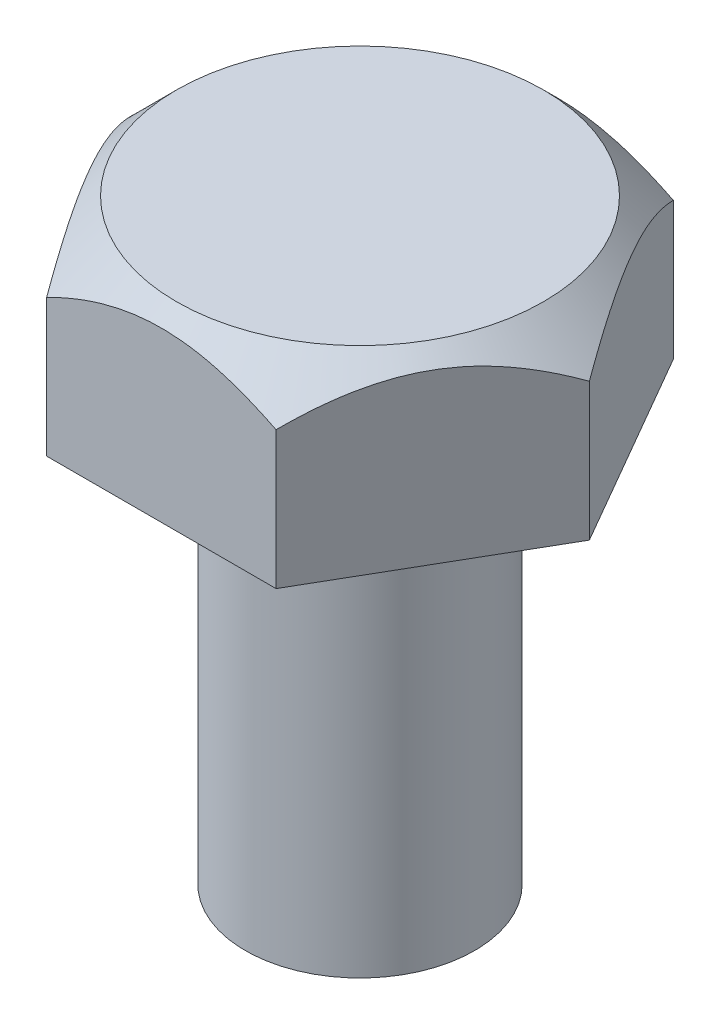
ISO-10303-21;
HEADER;
FILE_DESCRIPTION(('STEP AP214'),'2;1');
FILE_NAME('part.step','',(''),(''),'','','');
FILE_SCHEMA(('AUTOMOTIVE_DESIGN { 1 0 10303 214 1 1 1 1 }'));
ENDSEC;
DATA;
#1=APPLICATION_CONTEXT('core data for automotive mechanical design processes');
#2=APPLICATION_PROTOCOL_DEFINITION('international standard','automotive_design',2000,#1);
#3=PRODUCT_CONTEXT('',#1,'mechanical');
#4=PRODUCT('Part','Part','',(#3));
#5=PRODUCT_RELATED_PRODUCT_CATEGORY('part','',(#4));
#6=PRODUCT_DEFINITION_FORMATION('','',#4);
#7=PRODUCT_DEFINITION_CONTEXT('part definition',#1,'design');
#8=PRODUCT_DEFINITION('design','',#6,#7);
#9=PRODUCT_DEFINITION_SHAPE('','',#8);
#10=(LENGTH_UNIT() NAMED_UNIT(*) SI_UNIT(.MILLI.,.METRE.));
#11=(NAMED_UNIT(*) PLANE_ANGLE_UNIT() SI_UNIT($,.RADIAN.));
#12=(NAMED_UNIT(*) SI_UNIT($,.STERADIAN.) SOLID_ANGLE_UNIT());
#13=UNCERTAINTY_MEASURE_WITH_UNIT(LENGTH_MEASURE(1.E-05),#10,'distance_accuracy_value','');
#14=(GEOMETRIC_REPRESENTATION_CONTEXT(3) GLOBAL_UNCERTAINTY_ASSIGNED_CONTEXT((#13)) GLOBAL_UNIT_ASSIGNED_CONTEXT((#10,
#11,#12)) REPRESENTATION_CONTEXT('',''));
#15=CARTESIAN_POINT('',(0.,0.,0.));
#16=DIRECTION('',(0.,0.,1.));
#17=DIRECTION('',(1.,0.,0.));
#18=AXIS2_PLACEMENT_3D('',#15,#16,#17);
#19=CARTESIAN_POINT('',(0.,13.,0.));
#20=DIRECTION('',(0.,-1.,0.));
#21=DIRECTION('',(0.,0.,-1.));
#22=AXIS2_PLACEMENT_3D('',#19,#20,#21);
#23=CYLINDRICAL_SURFACE('',#22,2.5);
#24=CARTESIAN_POINT('',(0.,0.,0.));
#25=DIRECTION('',(0.,1.,0.));
#26=DIRECTION('',(0.,0.,1.));
#27=AXIS2_PLACEMENT_3D('',#24,#25,#26);
#28=CIRCLE('',#27,2.5);
#29=CARTESIAN_POINT('',(0.,0.,-2.5));
#30=VERTEX_POINT('',#29);
#31=EDGE_CURVE('E54',#30,#30,#28,.T.);
#32=CARTESIAN_POINT('',(0.,9.,0.));
#33=DIRECTION('',(0.,1.,0.));
#34=DIRECTION('',(0.,0.,1.));
#35=AXIS2_PLACEMENT_3D('',#32,#33,#34);
#36=CIRCLE('',#35,2.5);
#37=CARTESIAN_POINT('',(0.,9.,-2.5));
#38=VERTEX_POINT('',#37);
#39=EDGE_CURVE('E12',#38,#38,#36,.T.);
#40=CARTESIAN_POINT('',(0.,0.,-2.5));
#41=CARTESIAN_POINT('',(0.,0.0937500000000001,-2.5));
#42=CARTESIAN_POINT('',(0.,0.1875,-2.5));
#43=CARTESIAN_POINT('',(0.,0.375,-2.5));
#44=CARTESIAN_POINT('',(0.,0.46875,-2.5));
#45=CARTESIAN_POINT('',(0.,0.656250000000001,-2.5));
#46=CARTESIAN_POINT('',(0.,0.750000000000001,-2.5));
#47=CARTESIAN_POINT('',(0.,0.9375,-2.5));
#48=CARTESIAN_POINT('',(0.,1.03125,-2.5));
#49=CARTESIAN_POINT('',(0.,1.21875,-2.5));
#50=CARTESIAN_POINT('',(0.,1.3125,-2.5));
#51=CARTESIAN_POINT('',(0.,1.5,-2.5));
#52=CARTESIAN_POINT('',(0.,1.59375,-2.5));
#53=CARTESIAN_POINT('',(0.,1.78125,-2.5));
#54=CARTESIAN_POINT('',(0.,1.875,-2.5));
#55=CARTESIAN_POINT('',(0.,2.0625,-2.5));
#56=CARTESIAN_POINT('',(0.,2.15625,-2.5));
#57=CARTESIAN_POINT('',(0.,2.34375,-2.5));
#58=CARTESIAN_POINT('',(0.,2.4375,-2.5));
#59=CARTESIAN_POINT('',(0.,2.625,-2.5));
#60=CARTESIAN_POINT('',(0.,2.71875,-2.5));
#61=CARTESIAN_POINT('',(0.,2.90625,-2.5));
#62=CARTESIAN_POINT('',(0.,3.,-2.5));
#63=CARTESIAN_POINT('',(0.,3.1875,-2.5));
#64=CARTESIAN_POINT('',(0.,3.28125,-2.5));
#65=CARTESIAN_POINT('',(0.,3.46875,-2.5));
#66=CARTESIAN_POINT('',(0.,3.5625,-2.5));
#67=CARTESIAN_POINT('',(0.,3.75,-2.5));
#68=CARTESIAN_POINT('',(0.,3.84375,-2.5));
#69=CARTESIAN_POINT('',(0.,4.03125,-2.5));
#70=CARTESIAN_POINT('',(0.,4.125,-2.5));
#71=CARTESIAN_POINT('',(0.,4.3125,-2.5));
#72=CARTESIAN_POINT('',(0.,4.40625,-2.5));
#73=CARTESIAN_POINT('',(0.,4.59375,-2.5));
#74=CARTESIAN_POINT('',(0.,4.6875,-2.5));
#75=CARTESIAN_POINT('',(0.,4.875,-2.5));
#76=CARTESIAN_POINT('',(0.,4.96875,-2.5));
#77=CARTESIAN_POINT('',(0.,5.15625,-2.5));
#78=CARTESIAN_POINT('',(0.,5.25,-2.5));
#79=CARTESIAN_POINT('',(0.,5.4375,-2.5));
#80=CARTESIAN_POINT('',(0.,5.53125,-2.5));
#81=CARTESIAN_POINT('',(0.,5.71875,-2.5));
#82=CARTESIAN_POINT('',(0.,5.8125,-2.5));
#83=CARTESIAN_POINT('',(0.,6.,-2.5));
#84=CARTESIAN_POINT('',(0.,6.09375,-2.5));
#85=CARTESIAN_POINT('',(0.,6.28125,-2.5));
#86=CARTESIAN_POINT('',(0.,6.375,-2.5));
#87=CARTESIAN_POINT('',(0.,6.5625,-2.5));
#88=CARTESIAN_POINT('',(0.,6.65625,-2.5));
#89=CARTESIAN_POINT('',(0.,6.84375,-2.5));
#90=CARTESIAN_POINT('',(0.,6.9375,-2.5));
#91=CARTESIAN_POINT('',(0.,7.125,-2.5));
#92=CARTESIAN_POINT('',(0.,7.21875,-2.5));
#93=CARTESIAN_POINT('',(0.,7.40625,-2.5));
#94=CARTESIAN_POINT('',(0.,7.5,-2.5));
#95=CARTESIAN_POINT('',(0.,7.6875,-2.5));
#96=CARTESIAN_POINT('',(0.,7.78125,-2.5));
#97=CARTESIAN_POINT('',(0.,7.96875,-2.5));
#98=CARTESIAN_POINT('',(0.,8.0625,-2.5));
#99=CARTESIAN_POINT('',(0.,8.25,-2.5));
#100=CARTESIAN_POINT('',(0.,8.34375,-2.5));
#101=CARTESIAN_POINT('',(0.,8.53125,-2.5));
#102=CARTESIAN_POINT('',(0.,8.625,-2.5));
#103=CARTESIAN_POINT('',(0.,8.8125,-2.5));
#104=CARTESIAN_POINT('',(0.,8.90625,-2.5));
#105=CARTESIAN_POINT('',(0.,9.,-2.5));
#106=B_SPLINE_CURVE_WITH_KNOTS('',3,(#40,#41,#42,#43,#44,#45,#46,#47,#48,#49,#50,#51,#52,#53,
#54,#55,#56,#57,#58,#59,#60,#61,#62,#63,#64,#65,#66,#67,#68,#69,#70,#71,#72,#73,#74,#75,#76,#77,
#78,#79,#80,#81,#82,#83,#84,#85,#86,#87,#88,#89,#90,#91,#92,#93,#94,#95,#96,#97,#98,#99,#100,
#101,#102,#103,#104,#105),.UNSPECIFIED.,.F.,.F.,(4,2,2,2,2,2,2,2,2,2,2,2,2,2,2,2,2,2,2,2,2,2,2,
2,2,2,2,2,2,2,2,2,4),(0.,0.28125,0.5625,0.843750000000001,1.125,1.40625,1.6875,1.96875,2.25,
2.53125,2.8125,3.09375,3.375,3.65625,3.9375,4.21875,4.5,4.78125,5.0625,5.34375,5.625,5.90625,
6.1875,6.46875,6.75,7.03125,7.3125,7.59375,7.875,8.15625,8.4375,8.71875,9.),.UNSPECIFIED.);
#107=EDGE_CURVE('BSEAM46',#30,#38,#106,.T.);
#108=ORIENTED_EDGE('',*,*,#31,.T.);
#109=ORIENTED_EDGE('',*,*,#39,.F.);
#110=ORIENTED_EDGE('',*,*,#107,.T.);
#111=ORIENTED_EDGE('',*,*,#107,.F.);
#112=EDGE_LOOP('',(#108,#110,#109,#111));
#113=FACE_BOUND('',#112,.T.);
#114=ADVANCED_FACE('F46',(#113),#23,.T.);
#115=CARTESIAN_POINT('',(0.,0.,0.));
#116=DIRECTION('',(0.,1.,0.));
#117=DIRECTION('',(0.,0.,1.));
#118=AXIS2_PLACEMENT_3D('',#115,#116,#117);
#119=PLANE('',#118);
#120=ORIENTED_EDGE('',*,*,#31,.F.);
#121=EDGE_LOOP('',(#120));
#122=FACE_BOUND('',#121,.T.);
#123=ADVANCED_FACE('F243',(#122),#119,.F.);
#124=CARTESIAN_POINT('',(2.5,9.,4.3301270189222));
#125=DIRECTION('',(0.866025403784439,0.,0.5));
#126=DIRECTION('',(0.5,0.,-0.866025403784439));
#127=AXIS2_PLACEMENT_3D('',#124,#125,#126);
#128=PLANE('',#127);
#129=CARTESIAN_POINT('',(2.49988452994616,11.9998845259463,4.3303270189222));
#130=CARTESIAN_POINT('',(2.54287138041576,12.0428679014172,4.25587160985149));
#131=CARTESIAN_POINT('',(2.58618865330985,12.0845322160249,4.18084389235359));
#132=CARTESIAN_POINT('',(2.67354887274435,12.1648214570814,4.02953155373268));
#133=CARTESIAN_POINT('',(2.71759219997896,12.2034447234691,3.95324627322796));
#134=CARTESIAN_POINT('',(2.85131771209198,12.3144804420678,3.72162689198003));
#135=CARTESIAN_POINT('',(2.94213197757914,12.3815850955109,3.56433197010422));
#136=CARTESIAN_POINT('',(3.12526622915858,12.4964973477853,3.24713414176253));
#137=CARTESIAN_POINT('',(3.21753940303059,12.5445944631137,3.08731231644056));
#138=CARTESIAN_POINT('',(3.35746623690526,12.6002311247179,2.8449519308274));
#139=CARTESIAN_POINT('',(3.40431453249364,12.616017735568,2.76380830262032));
#140=CARTESIAN_POINT('',(3.4984078137364,12.6417307019677,2.60083395885699));
#141=CARTESIAN_POINT('',(3.54565273902893,12.6516579334098,2.51900334785054));
#142=CARTESIAN_POINT('',(3.66078037944806,12.6683021731439,2.31959642528907));
#143=CARTESIAN_POINT('',(3.72878713668329,12.6717946588034,2.20180526649965));
#144=CARTESIAN_POINT('',(3.86467809794897,12.6659341038672,1.96643521729812));
#145=CARTESIAN_POINT('',(3.93256225066695,12.6565765602643,1.84885641576182));
#146=CARTESIAN_POINT('',(4.06769057590285,12.6255675384182,1.61480729091154));
#147=CARTESIAN_POINT('',(4.13493394699394,12.6039023105296,1.49833835570957));
#148=CARTESIAN_POINT('',(4.26826494691756,12.5494557859257,1.26740228961789));
#149=CARTESIAN_POINT('',(4.33435266395686,12.516675341522,1.1529350059496));
#150=CARTESIAN_POINT('',(4.45167355371377,12.4492338613143,0.949729264101435));
#151=CARTESIAN_POINT('',(4.5031664451357,12.4163460937711,0.860540959930032));
#152=CARTESIAN_POINT('',(4.60522781060438,12.3452704801556,0.683765489448425));
#153=CARTESIAN_POINT('',(4.65579625649568,12.3070824729595,0.596178371904879));
#154=CARTESIAN_POINT('',(4.75584946376349,12.226262498628,0.422881133456824));
#155=CARTESIAN_POINT('',(4.80533707077893,12.1836445061233,0.337166083761072));
#156=CARTESIAN_POINT('',(4.90339584958638,12.0945241637333,0.167323296738408));
#157=CARTESIAN_POINT('',(4.95196756146993,12.048024196775,0.083194623945508));
#158=CARTESIAN_POINT('',(5.00011547005384,11.9998845259463,-0.000200000000000584));
#159=B_SPLINE_CURVE_WITH_KNOTS('',3,(#129,#130,#131,#132,#133,#134,#135,#136,#137,#138,#139,
#140,#141,#142,#143,#144,#145,#146,#147,#148,#149,#150,#151,#152,#153,#154,#155,#156,#157,#158),
.UNSPECIFIED.,.F.,.F.,(4,2,2,2,2,2,2,2,2,2,2,2,2,2,4),(0.,0.288343025050063,0.576842376266669,
1.15695604992332,1.72785747296512,2.01274823950903,2.29759640821263,2.70513724110404,
3.1128209240714,3.52096095288678,3.92906969271704,4.2532461784357,4.57743252106523,
4.90062556888121,5.22362166510138),.UNSPECIFIED.);
#160=CARTESIAN_POINT('',(2.5,12.,4.3301270189222));
#161=VERTEX_POINT('',#160);
#162=CARTESIAN_POINT('',(5.,12.,0.));
#163=VERTEX_POINT('',#162);
#164=EDGE_CURVE('E61',#161,#163,#159,.T.);
#165=ORIENTED_EDGE('',*,*,#164,.F.);
#166=DIRECTION('',(0.,1.,0.));
#167=VECTOR('',#166,1.);
#168=CARTESIAN_POINT('',(2.5,9.,4.3301270189222));
#169=LINE('',#168,#167);
#170=CARTESIAN_POINT('',(2.5,9.,4.3301270189222));
#171=VERTEX_POINT('',#170);
#172=EDGE_CURVE('E68',#171,#161,#169,.T.);
#173=ORIENTED_EDGE('',*,*,#172,.F.);
#174=DIRECTION('',(0.5,0.,-0.866025403784439));
#175=VECTOR('',#174,1.);
#176=CARTESIAN_POINT('',(2.5,9.,4.3301270189222));
#177=LINE('',#176,#175);
#178=CARTESIAN_POINT('',(5.,9.,0.));
#179=VERTEX_POINT('',#178);
#180=EDGE_CURVE('E175',#171,#179,#177,.T.);
#181=ORIENTED_EDGE('',*,*,#180,.T.);
#182=DIRECTION('',(0.,1.,0.));
#183=VECTOR('',#182,1.);
#184=CARTESIAN_POINT('',(5.,9.,0.));
#185=LINE('',#184,#183);
#186=EDGE_CURVE('E124',#179,#163,#185,.T.);
#187=ORIENTED_EDGE('',*,*,#186,.T.);
#188=EDGE_LOOP('',(#165,#173,#181,#187));
#189=FACE_BOUND('',#188,.T.);
#190=ADVANCED_FACE('F193',(#189),#128,.T.);
#191=CARTESIAN_POINT('',(-2.5,9.,4.3301270189222));
#192=DIRECTION('',(0.,0.,1.));
#193=DIRECTION('',(1.,0.,0.));
#194=AXIS2_PLACEMENT_3D('',#191,#192,#193);
#195=PLANE('',#194);
#196=CARTESIAN_POINT('',(-7.59921951359278,8.25367864666697,4.3301270189222));
#197=CARTESIAN_POINT('',(-7.48699247756581,8.35118426563294,4.3301270189222));
#198=CARTESIAN_POINT('',(-7.37450605913896,8.44839137505781,4.3301270189222));
#199=CARTESIAN_POINT('',(-7.14894544849832,8.64212478615553,4.3301270189222));
#200=CARTESIAN_POINT('',(-7.0358712467944,8.73865107677648,4.3301270189222));
#201=CARTESIAN_POINT('',(-6.69556519020093,9.02716624616906,4.3301270189222));
#202=CARTESIAN_POINT('',(-6.46735241242822,9.21800207958195,4.3301270189222));
#203=CARTESIAN_POINT('',(-6.00244910758804,9.59990517797513,4.3301270189222));
#204=CARTESIAN_POINT('',(-5.76568333547581,9.79088117220917,4.3301270189222));
#205=CARTESIAN_POINT('',(-5.28773027314544,10.1671121203224,4.3301270189222));
#206=CARTESIAN_POINT('',(-5.04654410187623,10.3523684910034,4.3301270189222));
#207=CARTESIAN_POINT('',(-4.55795427576486,10.7152539731287,4.3301270189222));
#208=CARTESIAN_POINT('',(-4.31054304061881,10.8928729934364,4.3301270189222));
#209=CARTESIAN_POINT('',(-3.93341818828448,11.1507750381669,4.3301270189222));
#210=CARTESIAN_POINT('',(-3.80664733518685,11.2353592003148,4.3301270189222));
#211=CARTESIAN_POINT('',(-3.55082533863257,11.4009968353064,4.3301270189222));
#212=CARTESIAN_POINT('',(-3.42177439311458,11.4820506125323,4.3301270189222));
#213=CARTESIAN_POINT('',(-3.16199806432158,11.639251894182,4.3301270189222));
#214=CARTESIAN_POINT('',(-3.03129190461664,11.7154310235148,4.3301270189222));
#215=CARTESIAN_POINT('',(-2.7669085874914,11.8625188449221,4.3301270189222));
#216=CARTESIAN_POINT('',(-2.63323107423655,11.9334269012938,4.3301270189222));
#217=CARTESIAN_POINT('',(-2.36276633080915,12.0685737969327,4.3301270189222));
#218=CARTESIAN_POINT('',(-2.22598396638432,12.1328222970525,4.3301270189222));
#219=CARTESIAN_POINT('',(-1.94889793365952,12.2531442688083,4.3301270189222));
#220=CARTESIAN_POINT('',(-1.80859565104085,12.3092209000482,4.3301270189222));
#221=CARTESIAN_POINT('',(-1.5210910162557,12.4124815838396,4.3301270189222));
#222=CARTESIAN_POINT('',(-1.37380428933832,12.459434008593,4.3301270189222));
#223=CARTESIAN_POINT('',(-1.07571750853243,12.5405572677146,4.3301270189222));
#224=CARTESIAN_POINT('',(-0.9249180184539,12.5747301384307,4.3301270189222));
#225=CARTESIAN_POINT('',(-0.621622317866132,12.6280097359017,4.3301270189222));
#226=CARTESIAN_POINT('',(-0.46914312625901,12.6472114182584,4.3301270189222));
#227=CARTESIAN_POINT('',(-0.163002209399467,12.6694938314688,4.3301270189222));
#228=CARTESIAN_POINT('',(-0.00934062284925477,12.6725764251674,4.3301270189222));
#229=CARTESIAN_POINT('',(0.297696033322765,12.6623702719493,4.3301270189222));
#230=CARTESIAN_POINT('',(0.451070124483321,12.6490527373931,4.3301270189222));
#231=CARTESIAN_POINT('',(0.755678508307857,12.6070212422452,4.3301270189222));
#232=CARTESIAN_POINT('',(0.906912363013276,12.5783041758869,4.3301270189222));
#233=CARTESIAN_POINT('',(1.20721128847461,12.5071281237141,4.3301270189222));
#234=CARTESIAN_POINT('',(1.35625267713972,12.4645709903875,4.3301270189222));
#235=CARTESIAN_POINT('',(1.65053794073623,12.3680526231404,4.3301270189222));
#236=CARTESIAN_POINT('',(1.79578174526941,12.3140911779791,4.3301270189222));
#237=CARTESIAN_POINT('',(2.11307073215612,12.1844175150299,4.3301270189222));
#238=CARTESIAN_POINT('',(2.28421549179871,12.1065212639994,4.3301270189222));
#239=CARTESIAN_POINT('',(2.62142059572484,11.9403251951652,4.3301270189222));
#240=CARTESIAN_POINT('',(2.78747795627214,11.8520194140098,4.3301270189222));
#241=CARTESIAN_POINT('',(3.11543948043553,11.6673110360987,4.3301270189222));
#242=CARTESIAN_POINT('',(3.2773344050716,11.570892168673,4.3301270189222));
#243=CARTESIAN_POINT('',(3.59727339089177,11.3719729247574,4.3301270189222));
#244=CARTESIAN_POINT('',(3.75531820223985,11.2694737465554,4.3301270189222));
#245=CARTESIAN_POINT('',(4.06905173475919,11.0591610978369,4.3301270189222));
#246=CARTESIAN_POINT('',(4.22472317767924,10.9513219741767,4.3301270189222));
#247=CARTESIAN_POINT('',(4.53336890520682,10.7318530724426,4.3301270189222));
#248=CARTESIAN_POINT('',(4.68634309311016,10.6202231588763,4.3301270189222));
#249=CARTESIAN_POINT('',(4.98984972858033,10.3940651748504,4.3301270189222));
#250=CARTESIAN_POINT('',(5.14038482040813,10.2795406432408,4.3301270189222));
#251=CARTESIAN_POINT('',(5.43955784308426,10.0480350376165,4.3301270189222));
#252=CARTESIAN_POINT('',(5.5881957110298,9.93105388249031,4.3301270189222));
#253=CARTESIAN_POINT('',(5.89518635745016,9.68603900594881,4.3301270189222));
#254=CARTESIAN_POINT('',(6.05341108869284,9.55784508755711,4.3301270189222));
#255=CARTESIAN_POINT('',(6.36829125211621,9.29954321420476,4.3301270189222));
#256=CARTESIAN_POINT('',(6.52494666451841,9.16943523517164,4.3301270189222));
#257=CARTESIAN_POINT('',(6.83518118684619,8.90910077400727,4.3301270189222));
#258=CARTESIAN_POINT('',(6.98877510446431,8.77889191202406,4.3301270189222));
#259=CARTESIAN_POINT('',(7.29480873067968,8.51719336283559,4.3301270189222));
#260=CARTESIAN_POINT('',(7.4472486907282,8.38570396982765,4.3301270189222));
#261=CARTESIAN_POINT('',(7.59921951359278,8.25367864666697,4.3301270189222));
#262=B_SPLINE_CURVE_WITH_KNOTS('',3,(#196,#197,#198,#199,#200,#201,#202,#203,#204,#205,#206,
#207,#208,#209,#210,#211,#212,#213,#214,#215,#216,#217,#218,#219,#220,#221,#222,#223,#224,#225,
#226,#227,#228,#229,#230,#231,#232,#233,#234,#235,#236,#237,#238,#239,#240,#241,#242,#243,#244,
#245,#246,#247,#248,#249,#250,#251,#252,#253,#254,#255,#256,#257,#258,#259,#260,#261),
.UNSPECIFIED.,.F.,.F.,(4,2,2,2,2,2,2,2,2,2,2,2,2,2,2,2,2,2,2,2,2,2,2,2,2,2,2,2,2,2,2,2,4),(0.,
0.446003957696259,0.892015138902986,1.78444545205319,2.6969412715932,3.60920921409759,
4.52264764303546,4.97979846611418,5.43690979628029,5.89066842739223,6.34448169430946,
6.79762713021694,7.25059689265077,7.71388352952138,8.17709631285965,8.63734668751579,
9.09754387095325,9.55855000507355,10.0196491495724,10.4840922330261,10.9485439200596,
11.5121821150824,12.0761447876206,12.6412667411846,13.2062776900007,13.7743322928723,
14.3424072208553,14.9098183649612,15.4772482730702,16.0881462572516,16.6990519310606,
17.303121069493,17.9070545540327),.UNSPECIFIED.);
#263=CARTESIAN_POINT('',(-2.5,12.,4.33012701892219));
#264=VERTEX_POINT('',#263);
#265=EDGE_CURVE('E186',#264,#161,#262,.T.);
#266=ORIENTED_EDGE('',*,*,#265,.F.);
#267=DIRECTION('',(0.,1.,0.));
#268=VECTOR('',#267,1.);
#269=CARTESIAN_POINT('',(-2.5,9.,4.3301270189222));
#270=LINE('',#269,#268);
#271=CARTESIAN_POINT('',(-2.5,9.,4.3301270189222));
#272=VERTEX_POINT('',#271);
#273=EDGE_CURVE('E138',#272,#264,#270,.T.);
#274=ORIENTED_EDGE('',*,*,#273,.F.);
#275=DIRECTION('',(1.,0.,0.));
#276=VECTOR('',#275,1.);
#277=CARTESIAN_POINT('',(-2.5,9.,4.3301270189222));
#278=LINE('',#277,#276);
#279=EDGE_CURVE('E130',#272,#171,#278,.T.);
#280=ORIENTED_EDGE('',*,*,#279,.T.);
#281=ORIENTED_EDGE('',*,*,#172,.T.);
#282=EDGE_LOOP('',(#266,#274,#280,#281));
#283=FACE_BOUND('',#282,.T.);
#284=ADVANCED_FACE('F230',(#283),#195,.T.);
#285=CARTESIAN_POINT('',(-5.,9.,0.));
#286=DIRECTION('',(-0.866025403784439,0.,0.5));
#287=DIRECTION('',(0.5,0.,0.866025403784438));
#288=AXIS2_PLACEMENT_3D('',#285,#286,#287);
#289=PLANE('',#288);
#290=CARTESIAN_POINT('',(-5.00011547005384,11.9998845259463,-0.000199999999998857));
#291=CARTESIAN_POINT('',(-4.95712861958424,12.0428679014172,0.0742554090707071));
#292=CARTESIAN_POINT('',(-4.91381134669015,12.0845322160249,0.149283126568604));
#293=CARTESIAN_POINT('',(-4.82645112725565,12.1648214570814,0.300595465189513));
#294=CARTESIAN_POINT('',(-4.78240780002105,12.2034447234691,0.376880745694239));
#295=CARTESIAN_POINT('',(-4.64868228790802,12.3144804420678,0.608500126942162));
#296=CARTESIAN_POINT('',(-4.55786802242086,12.3815850955109,0.765795048817973));
#297=CARTESIAN_POINT('',(-4.37473377084142,12.4964973477853,1.08299287715966));
#298=CARTESIAN_POINT('',(-4.28246059696941,12.5445944631137,1.24281470248163));
#299=CARTESIAN_POINT('',(-4.14253376309475,12.6002311247179,1.48517508809479));
#300=CARTESIAN_POINT('',(-4.09568546750636,12.616017735568,1.56631871630187));
#301=CARTESIAN_POINT('',(-4.0015921862636,12.6417307019677,1.7292930600652));
#302=CARTESIAN_POINT('',(-3.95434726097108,12.6516579334098,1.81112367107165));
#303=CARTESIAN_POINT('',(-3.83921962055194,12.6683021731439,2.01053059363312));
#304=CARTESIAN_POINT('',(-3.77121286331671,12.6717946588034,2.12832175242254));
#305=CARTESIAN_POINT('',(-3.63532190205104,12.6659341038672,2.36369180162406));
#306=CARTESIAN_POINT('',(-3.56743774933306,12.6565765602643,2.48127060316036));
#307=CARTESIAN_POINT('',(-3.43230942409715,12.6255675384182,2.71531972801065));
#308=CARTESIAN_POINT('',(-3.36506605300607,12.6039023105296,2.83178866321262));
#309=CARTESIAN_POINT('',(-3.23173505308244,12.5494557859257,3.0627247293043));
#310=CARTESIAN_POINT('',(-3.16564733604314,12.516675341522,3.17719201297259));
#311=CARTESIAN_POINT('',(-3.04832644628623,12.4492338613143,3.38039775482075));
#312=CARTESIAN_POINT('',(-2.99683355486431,12.4163460937711,3.46958605899216));
#313=CARTESIAN_POINT('',(-2.89477218939563,12.3452704801556,3.64636152947377));
#314=CARTESIAN_POINT('',(-2.84420374350432,12.3070824729595,3.73394864701731));
#315=CARTESIAN_POINT('',(-2.74415053623651,12.226262498628,3.90724588546537));
#316=CARTESIAN_POINT('',(-2.69466292922107,12.1836445061233,3.99296093516112));
#317=CARTESIAN_POINT('',(-2.59660415041362,12.0945241637333,4.16280372218379));
#318=CARTESIAN_POINT('',(-2.54803243853007,12.048024196775,4.24693239497669));
#319=CARTESIAN_POINT('',(-2.49988452994616,11.9998845259463,4.33032701892219));
#320=B_SPLINE_CURVE_WITH_KNOTS('',3,(#290,#291,#292,#293,#294,#295,#296,#297,#298,#299,#300,
#301,#302,#303,#304,#305,#306,#307,#308,#309,#310,#311,#312,#313,#314,#315,#316,#317,#318,#319),
.UNSPECIFIED.,.F.,.F.,(4,2,2,2,2,2,2,2,2,2,2,2,2,2,4),(0.,0.288343025050062,0.576842376266667,
1.15695604992332,1.72785747296512,2.01274823950902,2.29759640821263,2.70513724110403,
3.11282092407139,3.52096095288677,3.92906969271703,4.25324617843569,4.57743252106522,
4.90062556888121,5.22362166510138),.UNSPECIFIED.);
#321=CARTESIAN_POINT('',(-5.,12.,0.));
#322=VERTEX_POINT('',#321);
#323=EDGE_CURVE('E162',#322,#264,#320,.T.);
#324=ORIENTED_EDGE('',*,*,#323,.F.);
#325=DIRECTION('',(0.,1.,0.));
#326=VECTOR('',#325,1.);
#327=CARTESIAN_POINT('',(-5.,9.,0.));
#328=LINE('',#327,#326);
#329=CARTESIAN_POINT('',(-5.,9.,0.));
#330=VERTEX_POINT('',#329);
#331=EDGE_CURVE('E128',#330,#322,#328,.T.);
#332=ORIENTED_EDGE('',*,*,#331,.F.);
#333=DIRECTION('',(0.5,0.,0.866025403784438));
#334=VECTOR('',#333,1.);
#335=CARTESIAN_POINT('',(-5.,9.,0.));
#336=LINE('',#335,#334);
#337=EDGE_CURVE('E160',#330,#272,#336,.T.);
#338=ORIENTED_EDGE('',*,*,#337,.T.);
#339=ORIENTED_EDGE('',*,*,#273,.T.);
#340=EDGE_LOOP('',(#324,#332,#338,#339));
#341=FACE_BOUND('',#340,.T.);
#342=ADVANCED_FACE('F159',(#341),#289,.T.);
#343=CARTESIAN_POINT('',(-2.5,9.,-4.33012701892219));
#344=DIRECTION('',(-0.866025403784439,0.,-0.5));
#345=DIRECTION('',(-0.5,0.,0.866025403784439));
#346=AXIS2_PLACEMENT_3D('',#343,#344,#345);
#347=PLANE('',#346);
#348=CARTESIAN_POINT('',(-2.49988452994616,11.9998845259463,-4.33032701892219));
#349=CARTESIAN_POINT('',(-2.54287138041576,12.0428679014172,-4.25587160985149));
#350=CARTESIAN_POINT('',(-2.58618865330985,12.0845322160249,-4.18084389235359));
#351=CARTESIAN_POINT('',(-2.67354887274435,12.1648214570814,-4.02953155373268));
#352=CARTESIAN_POINT('',(-2.71759219997896,12.2034447234691,-3.95324627322795));
#353=CARTESIAN_POINT('',(-2.85131771209198,12.3144804420678,-3.72162689198003));
#354=CARTESIAN_POINT('',(-2.94213197757914,12.3815850955109,-3.56433197010422));
#355=CARTESIAN_POINT('',(-3.12526622915858,12.4964973477853,-3.24713414176253));
#356=CARTESIAN_POINT('',(-3.21753940303059,12.5445944631137,-3.08731231644057));
#357=CARTESIAN_POINT('',(-3.35746623690525,12.6002311247179,-2.8449519308274));
#358=CARTESIAN_POINT('',(-3.40431453249364,12.616017735568,-2.76380830262032));
#359=CARTESIAN_POINT('',(-3.4984078137364,12.6417307019677,-2.60083395885699));
#360=CARTESIAN_POINT('',(-3.54565273902892,12.6516579334098,-2.51900334785054));
#361=CARTESIAN_POINT('',(-3.66078037944806,12.6683021731439,-2.31959642528907));
#362=CARTESIAN_POINT('',(-3.72878713668329,12.6717946588034,-2.20180526649966));
#363=CARTESIAN_POINT('',(-3.86467809794897,12.6659341038672,-1.96643521729813));
#364=CARTESIAN_POINT('',(-3.93256225066694,12.6565765602643,-1.84885641576183));
#365=CARTESIAN_POINT('',(-4.06769057590285,12.6255675384182,-1.61480729091154));
#366=CARTESIAN_POINT('',(-4.13493394699393,12.6039023105296,-1.49833835570958));
#367=CARTESIAN_POINT('',(-4.26826494691756,12.5494557859257,-1.26740228961789));
#368=CARTESIAN_POINT('',(-4.33435266395686,12.516675341522,-1.1529350059496));
#369=CARTESIAN_POINT('',(-4.45167355371377,12.4492338613143,-0.949729264101438));
#370=CARTESIAN_POINT('',(-4.50316644513569,12.4163460937711,-0.860540959930034));
#371=CARTESIAN_POINT('',(-4.60522781060437,12.3452704801556,-0.683765489448426));
#372=CARTESIAN_POINT('',(-4.65579625649568,12.3070824729595,-0.59617837190488));
#373=CARTESIAN_POINT('',(-4.75584946376349,12.226262498628,-0.422881133456825));
#374=CARTESIAN_POINT('',(-4.80533707077893,12.1836445061233,-0.337166083761073));
#375=CARTESIAN_POINT('',(-4.90339584958638,12.0945241637333,-0.167323296738408));
#376=CARTESIAN_POINT('',(-4.95196756146993,12.048024196775,-0.083194623945507));
#377=CARTESIAN_POINT('',(-5.00011547005384,11.9998845259463,0.000200000000001662));
#378=B_SPLINE_CURVE_WITH_KNOTS('',3,(#348,#349,#350,#351,#352,#353,#354,#355,#356,#357,#358,
#359,#360,#361,#362,#363,#364,#365,#366,#367,#368,#369,#370,#371,#372,#373,#374,#375,#376,#377),
.UNSPECIFIED.,.F.,.F.,(4,2,2,2,2,2,2,2,2,2,2,2,2,2,4),(0.,0.288343025050062,0.576842376266668,
1.15695604992332,1.72785747296512,2.01274823950903,2.29759640821263,2.70513724110404,
3.11282092407139,3.52096095288677,3.92906969271704,4.25324617843569,4.57743252106522,
4.90062556888121,5.22362166510138),.UNSPECIFIED.);
#379=CARTESIAN_POINT('',(-2.5,12.,-4.33012701892219));
#380=VERTEX_POINT('',#379);
#381=EDGE_CURVE('E117',#380,#322,#378,.T.);
#382=ORIENTED_EDGE('',*,*,#381,.F.);
#383=DIRECTION('',(0.,1.,0.));
#384=VECTOR('',#383,1.);
#385=CARTESIAN_POINT('',(-2.5,9.,-4.33012701892219));
#386=LINE('',#385,#384);
#387=CARTESIAN_POINT('',(-2.5,9.,-4.33012701892219));
#388=VERTEX_POINT('',#387);
#389=EDGE_CURVE('E115',#388,#380,#386,.T.);
#390=ORIENTED_EDGE('',*,*,#389,.F.);
#391=DIRECTION('',(-0.5,0.,0.866025403784439));
#392=VECTOR('',#391,1.);
#393=CARTESIAN_POINT('',(-2.5,9.,-4.33012701892219));
#394=LINE('',#393,#392);
#395=EDGE_CURVE('E154',#388,#330,#394,.T.);
#396=ORIENTED_EDGE('',*,*,#395,.T.);
#397=ORIENTED_EDGE('',*,*,#331,.T.);
#398=EDGE_LOOP('',(#382,#390,#396,#397));
#399=FACE_BOUND('',#398,.T.);
#400=ADVANCED_FACE('F152',(#399),#347,.T.);
#401=CARTESIAN_POINT('',(2.5,9.,-4.33012701892219));
#402=DIRECTION('',(0.,0.,-1.));
#403=DIRECTION('',(-1.,0.,0.));
#404=AXIS2_PLACEMENT_3D('',#401,#402,#403);
#405=PLANE('',#404);
#406=CARTESIAN_POINT('',(7.59921951359279,8.25367864666697,-4.33012701892219));
#407=CARTESIAN_POINT('',(7.48699247756582,8.35118426563294,-4.33012701892219));
#408=CARTESIAN_POINT('',(7.37450605913897,8.44839137505781,-4.33012701892219));
#409=CARTESIAN_POINT('',(7.14894544849832,8.64212478615553,-4.33012701892219));
#410=CARTESIAN_POINT('',(7.03587124679441,8.73865107677647,-4.33012701892219));
#411=CARTESIAN_POINT('',(6.69556519020094,9.02716624616906,-4.33012701892219));
#412=CARTESIAN_POINT('',(6.46735241242823,9.21800207958195,-4.33012701892219));
#413=CARTESIAN_POINT('',(6.00244910758804,9.59990517797512,-4.33012701892219));
#414=CARTESIAN_POINT('',(5.76568333547581,9.79088117220917,-4.33012701892219));
#415=CARTESIAN_POINT('',(5.28773027314545,10.1671121203224,-4.33012701892219));
#416=CARTESIAN_POINT('',(5.04654410187623,10.3523684910034,-4.33012701892219));
#417=CARTESIAN_POINT('',(4.55795427576486,10.7152539731287,-4.33012701892219));
#418=CARTESIAN_POINT('',(4.31054304061881,10.8928729934364,-4.33012701892219));
#419=CARTESIAN_POINT('',(3.93341818828449,11.1507750381669,-4.33012701892219));
#420=CARTESIAN_POINT('',(3.80664733518685,11.2353592003148,-4.33012701892219));
#421=CARTESIAN_POINT('',(3.55082533863258,11.4009968353064,-4.33012701892219));
#422=CARTESIAN_POINT('',(3.42177439311459,11.4820506125323,-4.33012701892219));
#423=CARTESIAN_POINT('',(3.16199806432158,11.639251894182,-4.33012701892219));
#424=CARTESIAN_POINT('',(3.03129190461664,11.7154310235148,-4.33012701892219));
#425=CARTESIAN_POINT('',(2.7669085874914,11.8625188449221,-4.33012701892219));
#426=CARTESIAN_POINT('',(2.63323107423656,11.9334269012938,-4.33012701892219));
#427=CARTESIAN_POINT('',(2.36276633080915,12.0685737969327,-4.33012701892219));
#428=CARTESIAN_POINT('',(2.22598396638433,12.1328222970525,-4.33012701892219));
#429=CARTESIAN_POINT('',(1.94889793365953,12.2531442688083,-4.33012701892219));
#430=CARTESIAN_POINT('',(1.80859565104085,12.3092209000482,-4.33012701892219));
#431=CARTESIAN_POINT('',(1.5210910162557,12.4124815838396,-4.33012701892219));
#432=CARTESIAN_POINT('',(1.37380428933832,12.459434008593,-4.33012701892219));
#433=CARTESIAN_POINT('',(1.07571750853243,12.5405572677146,-4.33012701892219));
#434=CARTESIAN_POINT('',(0.924918018453902,12.5747301384307,-4.33012701892219));
#435=CARTESIAN_POINT('',(0.621622317866133,12.6280097359017,-4.33012701892219));
#436=CARTESIAN_POINT('',(0.469143126259011,12.6472114182584,-4.33012701892219));
#437=CARTESIAN_POINT('',(0.163002209399467,12.6694938314688,-4.33012701892219));
#438=CARTESIAN_POINT('',(0.00934062284925569,12.6725764251674,-4.33012701892219));
#439=CARTESIAN_POINT('',(-0.297696033322764,12.6623702719493,-4.33012701892219));
#440=CARTESIAN_POINT('',(-0.45107012448332,12.6490527373931,-4.33012701892219));
#441=CARTESIAN_POINT('',(-0.755678508307857,12.6070212422452,-4.33012701892219));
#442=CARTESIAN_POINT('',(-0.906912363013276,12.5783041758869,-4.33012701892219));
#443=CARTESIAN_POINT('',(-1.20721128847461,12.5071281237141,-4.33012701892219));
#444=CARTESIAN_POINT('',(-1.35625267713972,12.4645709903875,-4.33012701892219));
#445=CARTESIAN_POINT('',(-1.65053794073623,12.3680526231404,-4.33012701892219));
#446=CARTESIAN_POINT('',(-1.79578174526941,12.3140911779791,-4.33012701892219));
#447=CARTESIAN_POINT('',(-2.11307073215611,12.1844175150299,-4.33012701892219));
#448=CARTESIAN_POINT('',(-2.28421549179871,12.1065212639994,-4.33012701892219));
#449=CARTESIAN_POINT('',(-2.62142059572484,11.9403251951652,-4.33012701892219));
#450=CARTESIAN_POINT('',(-2.78747795627213,11.8520194140099,-4.33012701892219));
#451=CARTESIAN_POINT('',(-3.11543948043553,11.6673110360987,-4.33012701892219));
#452=CARTESIAN_POINT('',(-3.2773344050716,11.570892168673,-4.33012701892219));
#453=CARTESIAN_POINT('',(-3.59727339089177,11.3719729247574,-4.33012701892219));
#454=CARTESIAN_POINT('',(-3.75531820223985,11.2694737465554,-4.33012701892219));
#455=CARTESIAN_POINT('',(-4.06905173475919,11.0591610978369,-4.33012701892219));
#456=CARTESIAN_POINT('',(-4.22472317767924,10.9513219741767,-4.33012701892219));
#457=CARTESIAN_POINT('',(-4.53336890520681,10.7318530724426,-4.33012701892219));
#458=CARTESIAN_POINT('',(-4.68634309311016,10.6202231588763,-4.33012701892219));
#459=CARTESIAN_POINT('',(-4.98984972858032,10.3940651748505,-4.33012701892219));
#460=CARTESIAN_POINT('',(-5.14038482040812,10.2795406432409,-4.33012701892219));
#461=CARTESIAN_POINT('',(-5.43955784308425,10.0480350376165,-4.33012701892219));
#462=CARTESIAN_POINT('',(-5.5881957110298,9.93105388249031,-4.33012701892219));
#463=CARTESIAN_POINT('',(-5.89518635745015,9.68603900594882,-4.33012701892219));
#464=CARTESIAN_POINT('',(-6.05341108869283,9.55784508755712,-4.33012701892219));
#465=CARTESIAN_POINT('',(-6.36829125211621,9.29954321420476,-4.33012701892219));
#466=CARTESIAN_POINT('',(-6.52494666451841,9.16943523517165,-4.33012701892219));
#467=CARTESIAN_POINT('',(-6.83518118684619,8.90910077400727,-4.33012701892219));
#468=CARTESIAN_POINT('',(-6.98877510446432,8.77889191202406,-4.33012701892219));
#469=CARTESIAN_POINT('',(-7.29480873067968,8.51719336283559,-4.33012701892219));
#470=CARTESIAN_POINT('',(-7.4472486907282,8.38570396982765,-4.33012701892219));
#471=CARTESIAN_POINT('',(-7.59921951359279,8.25367864666697,-4.33012701892219));
#472=B_SPLINE_CURVE_WITH_KNOTS('',3,(#406,#407,#408,#409,#410,#411,#412,#413,#414,#415,#416,
#417,#418,#419,#420,#421,#422,#423,#424,#425,#426,#427,#428,#429,#430,#431,#432,#433,#434,#435,
#436,#437,#438,#439,#440,#441,#442,#443,#444,#445,#446,#447,#448,#449,#450,#451,#452,#453,#454,
#455,#456,#457,#458,#459,#460,#461,#462,#463,#464,#465,#466,#467,#468,#469,#470,#471),
.UNSPECIFIED.,.F.,.F.,(4,2,2,2,2,2,2,2,2,2,2,2,2,2,2,2,2,2,2,2,2,2,2,2,2,2,2,2,2,2,2,2,4),(0.,
0.446003957696259,0.892015138902987,1.78444545205319,2.6969412715932,3.60920921409759,
4.52264764303546,4.97979846611419,5.43690979628029,5.89066842739224,6.34448169430946,
6.79762713021695,7.25059689265077,7.71388352952139,8.17709631285965,8.63734668751579,
9.09754387095326,9.55855000507355,10.0196491495724,10.4840922330261,10.9485439200596,
11.5121821150824,12.0761447876206,12.6412667411846,13.2062776900007,13.7743322928723,
14.3424072208553,14.9098183649612,15.4772482730702,16.0881462572516,16.6990519310606,
17.303121069493,17.9070545540327),.UNSPECIFIED.);
#473=CARTESIAN_POINT('',(2.5,12.,-4.33012701892219));
#474=VERTEX_POINT('',#473);
#475=EDGE_CURVE('E101',#474,#380,#472,.T.);
#476=ORIENTED_EDGE('',*,*,#475,.F.);
#477=DIRECTION('',(0.,1.,0.));
#478=VECTOR('',#477,1.);
#479=CARTESIAN_POINT('',(2.5,9.,-4.33012701892219));
#480=LINE('',#479,#478);
#481=CARTESIAN_POINT('',(2.5,9.,-4.33012701892219));
#482=VERTEX_POINT('',#481);
#483=EDGE_CURVE('E113',#482,#474,#480,.T.);
#484=ORIENTED_EDGE('',*,*,#483,.F.);
#485=DIRECTION('',(-1.,0.,0.));
#486=VECTOR('',#485,1.);
#487=CARTESIAN_POINT('',(2.5,9.,-4.33012701892219));
#488=LINE('',#487,#486);
#489=EDGE_CURVE('E168',#482,#388,#488,.T.);
#490=ORIENTED_EDGE('',*,*,#489,.T.);
#491=ORIENTED_EDGE('',*,*,#389,.T.);
#492=EDGE_LOOP('',(#476,#484,#490,#491));
#493=FACE_BOUND('',#492,.T.);
#494=ADVANCED_FACE('F111',(#493),#405,.T.);
#495=CARTESIAN_POINT('',(5.,9.,0.));
#496=DIRECTION('',(0.866025403784439,0.,-0.5));
#497=DIRECTION('',(-0.5,0.,-0.866025403784439));
#498=AXIS2_PLACEMENT_3D('',#495,#496,#497);
#499=PLANE('',#498);
#500=CARTESIAN_POINT('',(5.00011547005384,11.9998845259463,0.000199999999998857));
#501=CARTESIAN_POINT('',(4.95712861958424,12.0428679014172,-0.0742554090707069));
#502=CARTESIAN_POINT('',(4.91381134669015,12.0845322160249,-0.149283126568604));
#503=CARTESIAN_POINT('',(4.82645112725565,12.1648214570814,-0.300595465189513));
#504=CARTESIAN_POINT('',(4.78240780002104,12.2034447234691,-0.37688074569424));
#505=CARTESIAN_POINT('',(4.64868228790802,12.3144804420678,-0.608500126942165));
#506=CARTESIAN_POINT('',(4.55786802242086,12.3815850955109,-0.765795048817976));
#507=CARTESIAN_POINT('',(4.37473377084142,12.4964973477853,-1.08299287715967));
#508=CARTESIAN_POINT('',(4.28246059696941,12.5445944631137,-1.24281470248163));
#509=CARTESIAN_POINT('',(4.14253376309474,12.6002311247179,-1.4851750880948));
#510=CARTESIAN_POINT('',(4.09568546750636,12.616017735568,-1.56631871630188));
#511=CARTESIAN_POINT('',(4.0015921862636,12.6417307019677,-1.72929306006521));
#512=CARTESIAN_POINT('',(3.95434726097108,12.6516579334098,-1.81112367107166));
#513=CARTESIAN_POINT('',(3.83921962055194,12.6683021731439,-2.01053059363313));
#514=CARTESIAN_POINT('',(3.77121286331671,12.6717946588034,-2.12832175242254));
#515=CARTESIAN_POINT('',(3.63532190205103,12.6659341038672,-2.36369180162407));
#516=CARTESIAN_POINT('',(3.56743774933306,12.6565765602643,-2.48127060316037));
#517=CARTESIAN_POINT('',(3.43230942409715,12.6255675384182,-2.71531972801065));
#518=CARTESIAN_POINT('',(3.36506605300606,12.6039023105296,-2.83178866321262));
#519=CARTESIAN_POINT('',(3.23173505308244,12.5494557859257,-3.0627247293043));
#520=CARTESIAN_POINT('',(3.16564733604314,12.516675341522,-3.1771920129726));
#521=CARTESIAN_POINT('',(3.04832644628623,12.4492338613143,-3.38039775482076));
#522=CARTESIAN_POINT('',(2.9968335548643,12.4163460937711,-3.46958605899216));
#523=CARTESIAN_POINT('',(2.89477218939563,12.3452704801556,-3.64636152947377));
#524=CARTESIAN_POINT('',(2.84420374350432,12.3070824729595,-3.73394864701731));
#525=CARTESIAN_POINT('',(2.74415053623651,12.226262498628,-3.90724588546537));
#526=CARTESIAN_POINT('',(2.69466292922107,12.1836445061233,-3.99296093516112));
#527=CARTESIAN_POINT('',(2.59660415041362,12.0945241637333,-4.16280372218379));
#528=CARTESIAN_POINT('',(2.54803243853007,12.048024196775,-4.24693239497668));
#529=CARTESIAN_POINT('',(2.49988452994616,11.9998845259463,-4.33032701892219));
#530=B_SPLINE_CURVE_WITH_KNOTS('',3,(#500,#501,#502,#503,#504,#505,#506,#507,#508,#509,#510,
#511,#512,#513,#514,#515,#516,#517,#518,#519,#520,#521,#522,#523,#524,#525,#526,#527,#528,#529),
.UNSPECIFIED.,.F.,.F.,(4,2,2,2,2,2,2,2,2,2,2,2,2,2,4),(0.,0.288343025050061,0.576842376266668,
1.15695604992332,1.72785747296512,2.01274823950903,2.29759640821263,2.70513724110404,
3.11282092407139,3.52096095288677,3.92906969271704,4.25324617843569,4.57743252106522,
4.90062556888121,5.22362166510138),.UNSPECIFIED.);
#531=EDGE_CURVE('E97',#163,#474,#530,.T.);
#532=ORIENTED_EDGE('',*,*,#531,.F.);
#533=ORIENTED_EDGE('',*,*,#186,.F.);
#534=DIRECTION('',(-0.5,0.,-0.866025403784439));
#535=VECTOR('',#534,1.);
#536=CARTESIAN_POINT('',(5.,9.,0.));
#537=LINE('',#536,#535);
#538=EDGE_CURVE('E122',#179,#482,#537,.T.);
#539=ORIENTED_EDGE('',*,*,#538,.T.);
#540=ORIENTED_EDGE('',*,*,#483,.T.);
#541=EDGE_LOOP('',(#532,#533,#539,#540));
#542=FACE_BOUND('',#541,.T.);
#543=ADVANCED_FACE('F120',(#542),#499,.T.);
#544=CARTESIAN_POINT('',(0.,9.,0.));
#545=DIRECTION('',(0.,1.,0.));
#546=DIRECTION('',(0.,0.,1.));
#547=AXIS2_PLACEMENT_3D('',#544,#545,#546);
#548=PLANE('',#547);
#549=ORIENTED_EDGE('',*,*,#39,.T.);
#550=EDGE_LOOP('',(#549));
#551=FACE_BOUND('',#550,.T.);
#552=ORIENTED_EDGE('',*,*,#180,.F.);
#553=ORIENTED_EDGE('',*,*,#279,.F.);
#554=ORIENTED_EDGE('',*,*,#337,.F.);
#555=ORIENTED_EDGE('',*,*,#395,.F.);
#556=ORIENTED_EDGE('',*,*,#489,.F.);
#557=ORIENTED_EDGE('',*,*,#538,.F.);
#558=EDGE_LOOP('',(#552,#553,#554,#555,#556,#557));
#559=FACE_BOUND('',#558,.T.);
#560=ADVANCED_FACE('F164',(#551,#559),#548,.F.);
#561=CARTESIAN_POINT('',(0.,13.,0.));
#562=DIRECTION('',(0.,-1.,0.));
#563=DIRECTION('',(0.,0.,-1.));
#564=AXIS2_PLACEMENT_3D('',#561,#562,#563);
#565=CONICAL_SURFACE('',#564,4.,0.785398163397449);
#566=ORIENTED_EDGE('',*,*,#164,.T.);
#567=ORIENTED_EDGE('',*,*,#531,.T.);
#568=ORIENTED_EDGE('',*,*,#475,.T.);
#569=ORIENTED_EDGE('',*,*,#381,.T.);
#570=ORIENTED_EDGE('',*,*,#323,.T.);
#571=ORIENTED_EDGE('',*,*,#265,.T.);
#572=EDGE_LOOP('',(#566,#567,#568,#569,#570,#571));
#573=FACE_BOUND('',#572,.T.);
#574=CARTESIAN_POINT('',(0.,13.,0.));
#575=DIRECTION('',(0.,-1.,0.));
#576=DIRECTION('',(0.,0.,-1.));
#577=AXIS2_PLACEMENT_3D('',#574,#575,#576);
#578=CIRCLE('',#577,4.);
#579=CARTESIAN_POINT('',(0.,13.,-4.));
#580=VERTEX_POINT('',#579);
#581=EDGE_CURVE('E107',#580,#580,#578,.T.);
#582=ORIENTED_EDGE('',*,*,#581,.T.);
#583=EDGE_LOOP('',(#582));
#584=FACE_BOUND('',#583,.T.);
#585=ADVANCED_FACE('F99',(#573,#584),#565,.T.);
#586=CARTESIAN_POINT('',(0.,13.,0.));
#587=DIRECTION('',(0.,1.,0.));
#588=DIRECTION('',(0.,0.,1.));
#589=AXIS2_PLACEMENT_3D('',#586,#587,#588);
#590=PLANE('',#589);
#591=ORIENTED_EDGE('',*,*,#581,.F.);
#592=EDGE_LOOP('',(#591));
#593=FACE_BOUND('',#592,.T.);
#594=ADVANCED_FACE('F200',(#593),#590,.T.);
#595=CLOSED_SHELL('',(#114,#123,#190,#284,#342,#400,#494,#543,#560,#585,#594));
#596=MANIFOLD_SOLID_BREP('B2',#595);
#597=ADVANCED_BREP_SHAPE_REPRESENTATION('',(#18,#596),#14);
#598=SHAPE_DEFINITION_REPRESENTATION(#9,#597);
ENDSEC;
END-ISO-10303-21;
